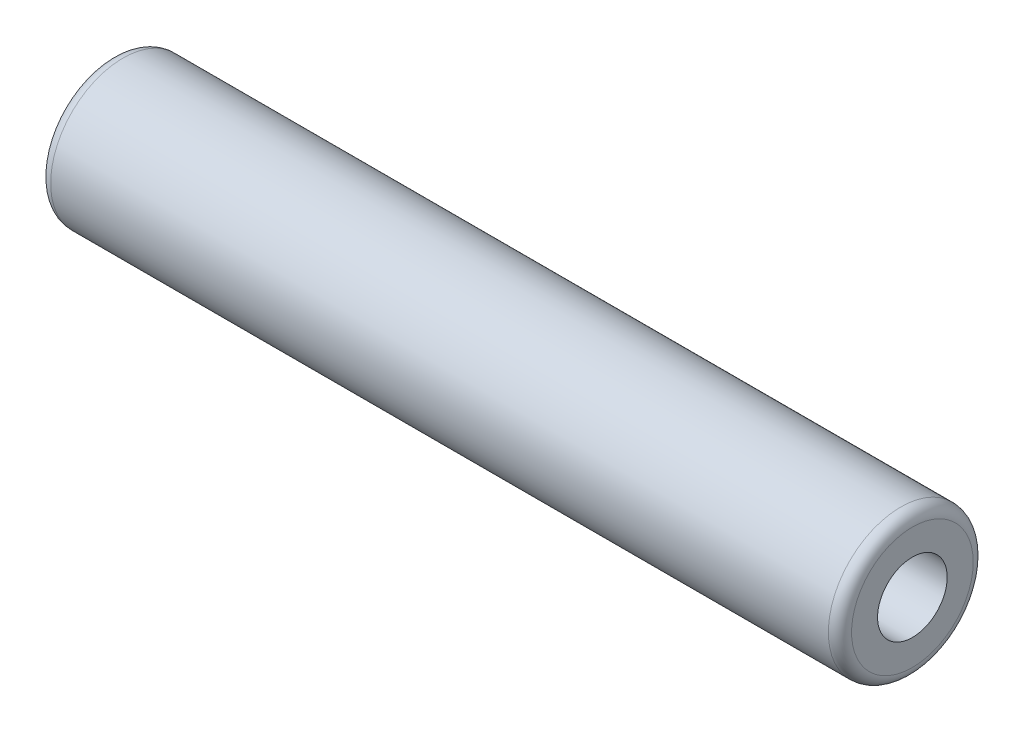
ISO-10303-21;
HEADER;
FILE_DESCRIPTION(('STEP AP214'),'2;1');
FILE_NAME('part.step','',(''),(''),'','','');
FILE_SCHEMA(('AUTOMOTIVE_DESIGN { 1 0 10303 214 1 1 1 1 }'));
ENDSEC;
DATA;
#1=APPLICATION_CONTEXT('core data for automotive mechanical design processes');
#2=APPLICATION_PROTOCOL_DEFINITION('international standard','automotive_design',2000,#1);
#3=PRODUCT_CONTEXT('',#1,'mechanical');
#4=PRODUCT('Part','Part','',(#3));
#5=PRODUCT_RELATED_PRODUCT_CATEGORY('part','',(#4));
#6=PRODUCT_DEFINITION_FORMATION('','',#4);
#7=PRODUCT_DEFINITION_CONTEXT('part definition',#1,'design');
#8=PRODUCT_DEFINITION('design','',#6,#7);
#9=PRODUCT_DEFINITION_SHAPE('','',#8);
#10=(LENGTH_UNIT() NAMED_UNIT(*) SI_UNIT(.MILLI.,.METRE.));
#11=(NAMED_UNIT(*) PLANE_ANGLE_UNIT() SI_UNIT($,.RADIAN.));
#12=(NAMED_UNIT(*) SI_UNIT($,.STERADIAN.) SOLID_ANGLE_UNIT());
#13=UNCERTAINTY_MEASURE_WITH_UNIT(LENGTH_MEASURE(1.E-05),#10,'distance_accuracy_value','');
#14=(GEOMETRIC_REPRESENTATION_CONTEXT(3) GLOBAL_UNCERTAINTY_ASSIGNED_CONTEXT((#13)) GLOBAL_UNIT_ASSIGNED_CONTEXT((#10,
#11,#12)) REPRESENTATION_CONTEXT('',''));
#15=CARTESIAN_POINT('',(0.,0.,0.));
#16=DIRECTION('',(0.,0.,1.));
#17=DIRECTION('',(1.,0.,0.));
#18=AXIS2_PLACEMENT_3D('',#15,#16,#17);
#19=CARTESIAN_POINT('',(109.5375,0.,0.));
#20=DIRECTION('',(1.,0.,0.));
#21=DIRECTION('',(0.,0.,-1.));
#22=AXIS2_PLACEMENT_3D('',#19,#20,#21);
#23=PLANE('',#22);
#24=CARTESIAN_POINT('',(109.5375,0.,0.));
#25=DIRECTION('',(1.,0.,0.));
#26=DIRECTION('',(0.,0.,-1.));
#27=AXIS2_PLACEMENT_3D('',#24,#25,#26);
#28=CIRCLE('',#27,8.3185);
#29=CARTESIAN_POINT('',(109.5375,0.,-8.3185));
#30=VERTEX_POINT('',#29);
#31=EDGE_CURVE('E10',#30,#30,#28,.T.);
#32=ORIENTED_EDGE('',*,*,#31,.T.);
#33=EDGE_LOOP('',(#32));
#34=FACE_BOUND('',#33,.T.);
#35=CARTESIAN_POINT('',(109.5375,0.,0.));
#36=DIRECTION('',(1.,0.,0.));
#37=DIRECTION('',(0.,0.,-1.));
#38=AXIS2_PLACEMENT_3D('',#35,#36,#37);
#39=CIRCLE('',#38,4.7625);
#40=CARTESIAN_POINT('',(109.5375,0.,-4.7625));
#41=VERTEX_POINT('',#40);
#42=EDGE_CURVE('E51',#41,#41,#39,.T.);
#43=ORIENTED_EDGE('',*,*,#42,.F.);
#44=EDGE_LOOP('',(#43));
#45=FACE_BOUND('',#44,.T.);
#46=ADVANCED_FACE('F31',(#34,#45),#23,.T.);
#47=CARTESIAN_POINT('',(0.,0.,0.));
#48=DIRECTION('',(1.,0.,0.));
#49=DIRECTION('',(0.,0.,-1.));
#50=AXIS2_PLACEMENT_3D('',#47,#48,#49);
#51=PLANE('',#50);
#52=CARTESIAN_POINT('',(0.,0.,0.));
#53=DIRECTION('',(1.,0.,0.));
#54=DIRECTION('',(0.,0.,-1.));
#55=AXIS2_PLACEMENT_3D('',#52,#53,#54);
#56=CIRCLE('',#55,8.3185);
#57=CARTESIAN_POINT('',(0.,0.,-8.3185));
#58=VERTEX_POINT('',#57);
#59=EDGE_CURVE('E38',#58,#58,#56,.F.);
#60=ORIENTED_EDGE('',*,*,#59,.T.);
#61=EDGE_LOOP('',(#60));
#62=FACE_BOUND('',#61,.T.);
#63=CARTESIAN_POINT('',(0.,0.,0.));
#64=DIRECTION('',(1.,0.,0.));
#65=DIRECTION('',(0.,0.,-1.));
#66=AXIS2_PLACEMENT_3D('',#63,#64,#65);
#67=CIRCLE('',#66,4.7625);
#68=CARTESIAN_POINT('',(0.,0.,-4.7625));
#69=VERTEX_POINT('',#68);
#70=EDGE_CURVE('E52',#69,#69,#67,.T.);
#71=ORIENTED_EDGE('',*,*,#70,.T.);
#72=EDGE_LOOP('',(#71));
#73=FACE_BOUND('',#72,.T.);
#74=ADVANCED_FACE('F62',(#62,#73),#51,.F.);
#75=CARTESIAN_POINT('',(109.5375,0.,0.));
#76=DIRECTION('',(-1.,0.,0.));
#77=DIRECTION('',(0.,0.,1.));
#78=AXIS2_PLACEMENT_3D('',#75,#76,#77);
#79=CYLINDRICAL_SURFACE('',#78,9.906);
#80=CARTESIAN_POINT('',(1.58750000000001,0.,0.));
#81=DIRECTION('',(1.,0.,0.));
#82=DIRECTION('',(0.,0.,-1.));
#83=AXIS2_PLACEMENT_3D('',#80,#81,#82);
#84=CIRCLE('',#83,9.906);
#85=CARTESIAN_POINT('',(1.58750000000001,0.,-9.906));
#86=VERTEX_POINT('',#85);
#87=EDGE_CURVE('E42',#86,#86,#84,.T.);
#88=ORIENTED_EDGE('',*,*,#87,.T.);
#89=EDGE_LOOP('',(#88));
#90=FACE_BOUND('',#89,.T.);
#91=CARTESIAN_POINT('',(107.95,0.,0.));
#92=DIRECTION('',(1.,0.,0.));
#93=DIRECTION('',(0.,0.,-1.));
#94=AXIS2_PLACEMENT_3D('',#91,#92,#93);
#95=CIRCLE('',#94,9.906);
#96=CARTESIAN_POINT('',(107.95,0.,-9.906));
#97=VERTEX_POINT('',#96);
#98=EDGE_CURVE('E46',#97,#97,#95,.F.);
#99=ORIENTED_EDGE('',*,*,#98,.T.);
#100=EDGE_LOOP('',(#99));
#101=FACE_BOUND('',#100,.T.);
#102=ADVANCED_FACE('F67',(#90,#101),#79,.T.);
#103=CARTESIAN_POINT('',(109.5375,0.,0.));
#104=DIRECTION('',(-1.,0.,0.));
#105=DIRECTION('',(0.,0.,1.));
#106=AXIS2_PLACEMENT_3D('',#103,#104,#105);
#107=CYLINDRICAL_SURFACE('',#106,4.7625);
#108=ORIENTED_EDGE('',*,*,#42,.T.);
#109=EDGE_LOOP('',(#108));
#110=FACE_BOUND('',#109,.T.);
#111=ORIENTED_EDGE('',*,*,#70,.F.);
#112=EDGE_LOOP('',(#111));
#113=FACE_BOUND('',#112,.T.);
#114=ADVANCED_FACE('F58',(#110,#113),#107,.F.);
#115=CARTESIAN_POINT('',(1.58750000000001,0.,0.));
#116=DIRECTION('',(1.,0.,0.));
#117=DIRECTION('',(0.,0.,-1.));
#118=AXIS2_PLACEMENT_3D('',#115,#116,#117);
#119=TOROIDAL_SURFACE('',#118,8.3185,1.5875);
#120=ORIENTED_EDGE('',*,*,#59,.F.);
#121=EDGE_LOOP('',(#120));
#122=FACE_BOUND('',#121,.T.);
#123=ORIENTED_EDGE('',*,*,#87,.F.);
#124=EDGE_LOOP('',(#123));
#125=FACE_BOUND('',#124,.T.);
#126=ADVANCED_FACE('F73',(#122,#125),#119,.T.);
#127=CARTESIAN_POINT('',(107.95,0.,0.));
#128=DIRECTION('',(1.,0.,0.));
#129=DIRECTION('',(0.,0.,-1.));
#130=AXIS2_PLACEMENT_3D('',#127,#128,#129);
#131=TOROIDAL_SURFACE('',#130,8.3185,1.5875);
#132=ORIENTED_EDGE('',*,*,#98,.F.);
#133=EDGE_LOOP('',(#132));
#134=FACE_BOUND('',#133,.T.);
#135=ORIENTED_EDGE('',*,*,#31,.F.);
#136=EDGE_LOOP('',(#135));
#137=FACE_BOUND('',#136,.T.);
#138=ADVANCED_FACE('F33',(#134,#137),#131,.T.);
#139=CLOSED_SHELL('',(#46,#74,#102,#114,#126,#138));
#140=MANIFOLD_SOLID_BREP('B2',#139);
#141=ADVANCED_BREP_SHAPE_REPRESENTATION('',(#18,#140),#14);
#142=SHAPE_DEFINITION_REPRESENTATION(#9,#141);
ENDSEC;
END-ISO-10303-21;
